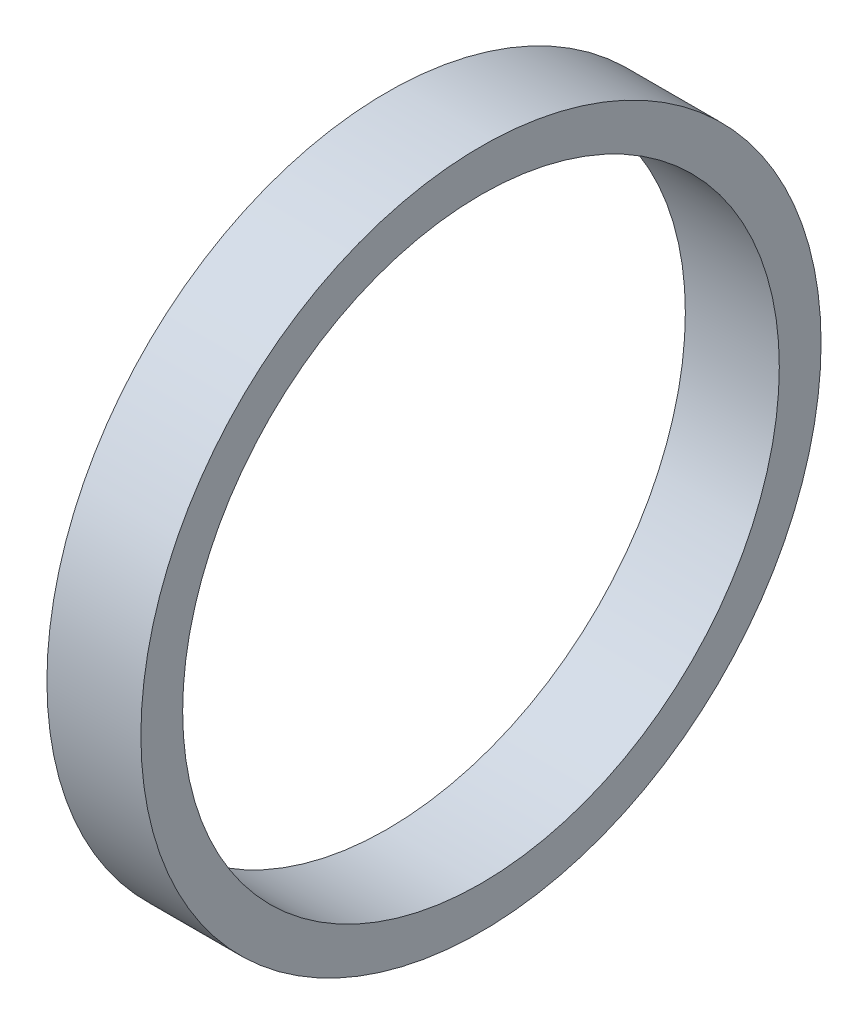
ISO-10303-21;
HEADER;
FILE_DESCRIPTION(('STEP AP214'),'2;1');
FILE_NAME('part.step','',(''),(''),'','','');
FILE_SCHEMA(('AUTOMOTIVE_DESIGN { 1 0 10303 214 1 1 1 1 }'));
ENDSEC;
DATA;
#1=APPLICATION_CONTEXT('core data for automotive mechanical design processes');
#2=APPLICATION_PROTOCOL_DEFINITION('international standard','automotive_design',2000,#1);
#3=PRODUCT_CONTEXT('',#1,'mechanical');
#4=PRODUCT('Part','Part','',(#3));
#5=PRODUCT_RELATED_PRODUCT_CATEGORY('part','',(#4));
#6=PRODUCT_DEFINITION_FORMATION('','',#4);
#7=PRODUCT_DEFINITION_CONTEXT('part definition',#1,'design');
#8=PRODUCT_DEFINITION('design','',#6,#7);
#9=PRODUCT_DEFINITION_SHAPE('','',#8);
#10=(LENGTH_UNIT() NAMED_UNIT(*) SI_UNIT(.MILLI.,.METRE.));
#11=(NAMED_UNIT(*) PLANE_ANGLE_UNIT() SI_UNIT($,.RADIAN.));
#12=(NAMED_UNIT(*) SI_UNIT($,.STERADIAN.) SOLID_ANGLE_UNIT());
#13=UNCERTAINTY_MEASURE_WITH_UNIT(LENGTH_MEASURE(1.E-05),#10,'distance_accuracy_value','');
#14=(GEOMETRIC_REPRESENTATION_CONTEXT(3) GLOBAL_UNCERTAINTY_ASSIGNED_CONTEXT((#13)) GLOBAL_UNIT_ASSIGNED_CONTEXT((#10,
#11,#12)) REPRESENTATION_CONTEXT('',''));
#15=CARTESIAN_POINT('',(0.,0.,0.));
#16=DIRECTION('',(0.,0.,1.));
#17=DIRECTION('',(1.,0.,0.));
#18=AXIS2_PLACEMENT_3D('',#15,#16,#17);
#19=CARTESIAN_POINT('',(1.,0.,0.));
#20=DIRECTION('',(1.,0.,0.));
#21=DIRECTION('',(0.,0.,-1.));
#22=AXIS2_PLACEMENT_3D('',#19,#20,#21);
#23=PLANE('',#22);
#24=CARTESIAN_POINT('',(1.,0.,0.));
#25=DIRECTION('',(1.,0.,0.));
#26=DIRECTION('',(0.,0.,-1.));
#27=AXIS2_PLACEMENT_3D('',#24,#25,#26);
#28=CIRCLE('',#27,3.6195);
#29=CARTESIAN_POINT('',(1.,0.,-3.6195));
#30=VERTEX_POINT('',#29);
#31=EDGE_CURVE('E10',#30,#30,#28,.T.);
#32=ORIENTED_EDGE('',*,*,#31,.T.);
#33=EDGE_LOOP('',(#32));
#34=FACE_BOUND('',#33,.T.);
#35=CARTESIAN_POINT('',(1.,0.,0.));
#36=DIRECTION('',(1.,0.,0.));
#37=DIRECTION('',(0.,0.,-1.));
#38=AXIS2_PLACEMENT_3D('',#35,#36,#37);
#39=CIRCLE('',#38,3.175);
#40=CARTESIAN_POINT('',(1.,0.,-3.175));
#41=VERTEX_POINT('',#40);
#42=EDGE_CURVE('E54',#41,#41,#39,.T.);
#43=ORIENTED_EDGE('',*,*,#42,.F.);
#44=EDGE_LOOP('',(#43));
#45=FACE_BOUND('',#44,.T.);
#46=ADVANCED_FACE('F41',(#34,#45),#23,.T.);
#47=CARTESIAN_POINT('',(0.,0.,0.));
#48=DIRECTION('',(1.,0.,0.));
#49=DIRECTION('',(0.,0.,-1.));
#50=AXIS2_PLACEMENT_3D('',#47,#48,#49);
#51=PLANE('',#50);
#52=CARTESIAN_POINT('',(0.,0.,0.));
#53=DIRECTION('',(1.,0.,0.));
#54=DIRECTION('',(0.,0.,-1.));
#55=AXIS2_PLACEMENT_3D('',#52,#53,#54);
#56=CIRCLE('',#55,3.6195);
#57=CARTESIAN_POINT('',(0.,0.,-3.6195));
#58=VERTEX_POINT('',#57);
#59=EDGE_CURVE('E45',#58,#58,#56,.T.);
#60=ORIENTED_EDGE('',*,*,#59,.F.);
#61=EDGE_LOOP('',(#60));
#62=FACE_BOUND('',#61,.T.);
#63=CARTESIAN_POINT('',(0.,0.,0.));
#64=DIRECTION('',(1.,0.,0.));
#65=DIRECTION('',(0.,0.,-1.));
#66=AXIS2_PLACEMENT_3D('',#63,#64,#65);
#67=CIRCLE('',#66,3.175);
#68=CARTESIAN_POINT('',(0.,0.,-3.175));
#69=VERTEX_POINT('',#68);
#70=EDGE_CURVE('E56',#69,#69,#67,.T.);
#71=ORIENTED_EDGE('',*,*,#70,.T.);
#72=EDGE_LOOP('',(#71));
#73=FACE_BOUND('',#72,.T.);
#74=ADVANCED_FACE('F68',(#62,#73),#51,.F.);
#75=CARTESIAN_POINT('',(1.,0.,0.));
#76=DIRECTION('',(-1.,0.,0.));
#77=DIRECTION('',(0.,0.,1.));
#78=AXIS2_PLACEMENT_3D('',#75,#76,#77);
#79=CYLINDRICAL_SURFACE('',#78,3.6195);
#80=ORIENTED_EDGE('',*,*,#31,.F.);
#81=EDGE_LOOP('',(#80));
#82=FACE_BOUND('',#81,.T.);
#83=ORIENTED_EDGE('',*,*,#59,.T.);
#84=EDGE_LOOP('',(#83));
#85=FACE_BOUND('',#84,.T.);
#86=ADVANCED_FACE('F43',(#82,#85),#79,.T.);
#87=CARTESIAN_POINT('',(1.,0.,0.));
#88=DIRECTION('',(-1.,0.,0.));
#89=DIRECTION('',(0.,0.,1.));
#90=AXIS2_PLACEMENT_3D('',#87,#88,#89);
#91=CYLINDRICAL_SURFACE('',#90,3.175);
#92=ORIENTED_EDGE('',*,*,#42,.T.);
#93=EDGE_LOOP('',(#92));
#94=FACE_BOUND('',#93,.T.);
#95=ORIENTED_EDGE('',*,*,#70,.F.);
#96=EDGE_LOOP('',(#95));
#97=FACE_BOUND('',#96,.T.);
#98=ADVANCED_FACE('F64',(#94,#97),#91,.F.);
#99=CLOSED_SHELL('',(#46,#74,#86,#98));
#100=MANIFOLD_SOLID_BREP('B2',#99);
#101=ADVANCED_BREP_SHAPE_REPRESENTATION('',(#18,#100),#14);
#102=SHAPE_DEFINITION_REPRESENTATION(#9,#101);
ENDSEC;
END-ISO-10303-21;
